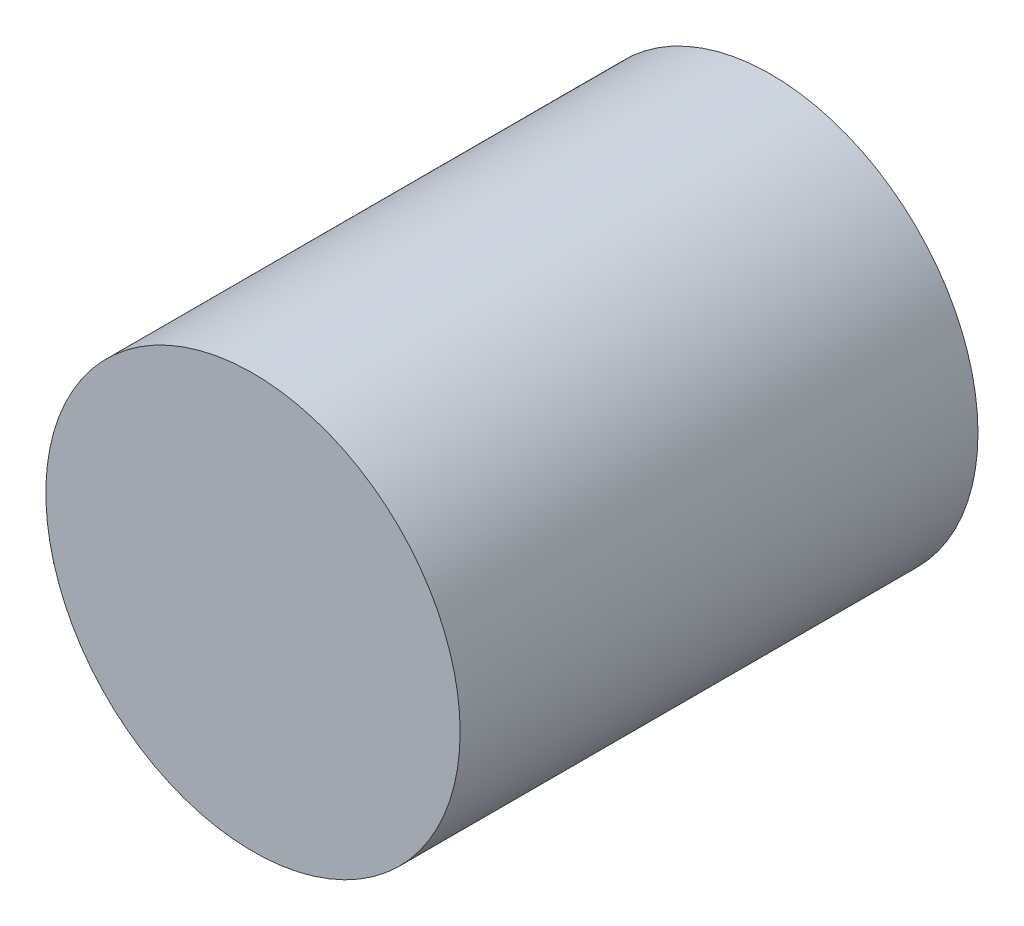
ISO-10303-21;
HEADER;
FILE_DESCRIPTION(('STEP AP214'),'2;1');
FILE_NAME('part.step','',(''),(''),'','','');
FILE_SCHEMA(('AUTOMOTIVE_DESIGN { 1 0 10303 214 1 1 1 1 }'));
ENDSEC;
DATA;
#1=APPLICATION_CONTEXT('core data for automotive mechanical design processes');
#2=APPLICATION_PROTOCOL_DEFINITION('international standard','automotive_design',2000,#1);
#3=PRODUCT_CONTEXT('',#1,'mechanical');
#4=PRODUCT('Part','Part','',(#3));
#5=PRODUCT_RELATED_PRODUCT_CATEGORY('part','',(#4));
#6=PRODUCT_DEFINITION_FORMATION('','',#4);
#7=PRODUCT_DEFINITION_CONTEXT('part definition',#1,'design');
#8=PRODUCT_DEFINITION('design','',#6,#7);
#9=PRODUCT_DEFINITION_SHAPE('','',#8);
#10=(LENGTH_UNIT() NAMED_UNIT(*) SI_UNIT(.MILLI.,.METRE.));
#11=(NAMED_UNIT(*) PLANE_ANGLE_UNIT() SI_UNIT($,.RADIAN.));
#12=(NAMED_UNIT(*) SI_UNIT($,.STERADIAN.) SOLID_ANGLE_UNIT());
#13=UNCERTAINTY_MEASURE_WITH_UNIT(LENGTH_MEASURE(1.E-05),#10,'distance_accuracy_value','');
#14=(GEOMETRIC_REPRESENTATION_CONTEXT(3) GLOBAL_UNCERTAINTY_ASSIGNED_CONTEXT((#13)) GLOBAL_UNIT_ASSIGNED_CONTEXT((#10,
#11,#12)) REPRESENTATION_CONTEXT('',''));
#15=CARTESIAN_POINT('',(0.,0.,0.));
#16=DIRECTION('',(0.,0.,1.));
#17=DIRECTION('',(1.,0.,0.));
#18=AXIS2_PLACEMENT_3D('',#15,#16,#17);
#19=CARTESIAN_POINT('',(0.,0.,200.));
#20=DIRECTION('',(0.,0.,-1.));
#21=DIRECTION('',(-1.,0.,0.));
#22=AXIS2_PLACEMENT_3D('',#19,#20,#21);
#23=CYLINDRICAL_SURFACE('',#22,80.);
#24=CARTESIAN_POINT('',(0.,0.,200.));
#25=DIRECTION('',(0.,0.,1.));
#26=DIRECTION('',(1.,0.,0.));
#27=AXIS2_PLACEMENT_3D('',#24,#25,#26);
#28=CIRCLE('',#27,80.);
#29=CARTESIAN_POINT('',(80.,0.,200.));
#30=VERTEX_POINT('',#29);
#31=EDGE_CURVE('E51',#30,#30,#28,.T.);
#32=ORIENTED_EDGE('',*,*,#31,.F.);
#33=EDGE_LOOP('',(#32));
#34=FACE_BOUND('',#33,.T.);
#35=CARTESIAN_POINT('',(0.,0.,0.));
#36=DIRECTION('',(0.,0.,1.));
#37=DIRECTION('',(1.,0.,0.));
#38=AXIS2_PLACEMENT_3D('',#35,#36,#37);
#39=CIRCLE('',#38,80.);
#40=CARTESIAN_POINT('',(80.,0.,0.));
#41=VERTEX_POINT('',#40);
#42=EDGE_CURVE('E40',#41,#41,#39,.T.);
#43=ORIENTED_EDGE('',*,*,#42,.T.);
#44=EDGE_LOOP('',(#43));
#45=FACE_BOUND('',#44,.T.);
#46=ADVANCED_FACE('F37',(#34,#45),#23,.T.);
#47=CARTESIAN_POINT('',(0.,0.,200.));
#48=DIRECTION('',(0.,0.,1.));
#49=DIRECTION('',(1.,0.,0.));
#50=AXIS2_PLACEMENT_3D('',#47,#48,#49);
#51=PLANE('',#50);
#52=ORIENTED_EDGE('',*,*,#31,.T.);
#53=EDGE_LOOP('',(#52));
#54=FACE_BOUND('',#53,.T.);
#55=ADVANCED_FACE('F72',(#54),#51,.T.);
#56=CARTESIAN_POINT('',(0.,0.,0.));
#57=DIRECTION('',(0.,0.,1.));
#58=DIRECTION('',(1.,0.,0.));
#59=AXIS2_PLACEMENT_3D('',#56,#57,#58);
#60=PLANE('',#59);
#61=CARTESIAN_POINT('',(0.,0.,0.));
#62=DIRECTION('',(0.,0.,-1.));
#63=DIRECTION('',(-1.,0.,0.));
#64=AXIS2_PLACEMENT_3D('',#61,#62,#63);
#65=CIRCLE('',#64,44.);
#66=CARTESIAN_POINT('',(-44.,0.,0.));
#67=VERTEX_POINT('',#66);
#68=EDGE_CURVE('E45',#67,#67,#65,.T.);
#69=ORIENTED_EDGE('',*,*,#68,.F.);
#70=EDGE_LOOP('',(#69));
#71=FACE_BOUND('',#70,.T.);
#72=ORIENTED_EDGE('',*,*,#42,.F.);
#73=EDGE_LOOP('',(#72));
#74=FACE_BOUND('',#73,.T.);
#75=ADVANCED_FACE('F69',(#71,#74),#60,.F.);
#76=CARTESIAN_POINT('',(0.,0.,-14.));
#77=DIRECTION('',(0.,0.,1.));
#78=DIRECTION('',(1.,0.,0.));
#79=AXIS2_PLACEMENT_3D('',#76,#77,#78);
#80=CYLINDRICAL_SURFACE('',#79,44.);
#81=CARTESIAN_POINT('',(0.,0.,-14.));
#82=DIRECTION('',(0.,0.,-1.));
#83=DIRECTION('',(-1.,0.,0.));
#84=AXIS2_PLACEMENT_3D('',#81,#82,#83);
#85=CIRCLE('',#84,44.);
#86=CARTESIAN_POINT('',(-44.,0.,-14.));
#87=VERTEX_POINT('',#86);
#88=EDGE_CURVE('E57',#87,#87,#85,.T.);
#89=ORIENTED_EDGE('',*,*,#88,.F.);
#90=EDGE_LOOP('',(#89));
#91=FACE_BOUND('',#90,.T.);
#92=ORIENTED_EDGE('',*,*,#68,.T.);
#93=EDGE_LOOP('',(#92));
#94=FACE_BOUND('',#93,.T.);
#95=ADVANCED_FACE('F71',(#91,#94),#80,.T.);
#96=CARTESIAN_POINT('',(0.,0.,-14.));
#97=DIRECTION('',(0.,0.,-1.));
#98=DIRECTION('',(-1.,0.,0.));
#99=AXIS2_PLACEMENT_3D('',#96,#97,#98);
#100=PLANE('',#99);
#101=CARTESIAN_POINT('',(0.,0.,-14.));
#102=DIRECTION('',(0.,0.,-1.));
#103=DIRECTION('',(-1.,0.,0.));
#104=AXIS2_PLACEMENT_3D('',#101,#102,#103);
#105=CIRCLE('',#104,30.);
#106=CARTESIAN_POINT('',(-30.,0.,-14.));
#107=VERTEX_POINT('',#106);
#108=EDGE_CURVE('E10',#107,#107,#105,.T.);
#109=ORIENTED_EDGE('',*,*,#108,.F.);
#110=EDGE_LOOP('',(#109));
#111=FACE_BOUND('',#110,.T.);
#112=ORIENTED_EDGE('',*,*,#88,.T.);
#113=EDGE_LOOP('',(#112));
#114=FACE_BOUND('',#113,.T.);
#115=ADVANCED_FACE('F78',(#111,#114),#100,.T.);
#116=CARTESIAN_POINT('',(0.,0.,-21.));
#117=DIRECTION('',(0.,0.,1.));
#118=DIRECTION('',(1.,0.,0.));
#119=AXIS2_PLACEMENT_3D('',#116,#117,#118);
#120=CYLINDRICAL_SURFACE('',#119,30.);
#121=CARTESIAN_POINT('',(0.,0.,-21.));
#122=DIRECTION('',(0.,0.,-1.));
#123=DIRECTION('',(-1.,0.,0.));
#124=AXIS2_PLACEMENT_3D('',#121,#122,#123);
#125=CIRCLE('',#124,30.);
#126=CARTESIAN_POINT('',(-30.,0.,-21.));
#127=VERTEX_POINT('',#126);
#128=EDGE_CURVE('E55',#127,#127,#125,.T.);
#129=ORIENTED_EDGE('',*,*,#128,.F.);
#130=EDGE_LOOP('',(#129));
#131=FACE_BOUND('',#130,.T.);
#132=ORIENTED_EDGE('',*,*,#108,.T.);
#133=EDGE_LOOP('',(#132));
#134=FACE_BOUND('',#133,.T.);
#135=ADVANCED_FACE('F110',(#131,#134),#120,.T.);
#136=CARTESIAN_POINT('',(0.,0.,-21.));
#137=DIRECTION('',(0.,0.,-1.));
#138=DIRECTION('',(-1.,0.,0.));
#139=AXIS2_PLACEMENT_3D('',#136,#137,#138);
#140=PLANE('',#139);
#141=CARTESIAN_POINT('',(0.,0.,-21.));
#142=DIRECTION('',(0.,0.,-1.));
#143=DIRECTION('',(-1.,0.,0.));
#144=AXIS2_PLACEMENT_3D('',#141,#142,#143);
#145=CIRCLE('',#144,21.5);
#146=CARTESIAN_POINT('',(-21.5,0.,-21.));
#147=VERTEX_POINT('',#146);
#148=EDGE_CURVE('E158',#147,#147,#145,.T.);
#149=ORIENTED_EDGE('',*,*,#148,.F.);
#150=EDGE_LOOP('',(#149));
#151=FACE_BOUND('',#150,.T.);
#152=ORIENTED_EDGE('',*,*,#128,.T.);
#153=EDGE_LOOP('',(#152));
#154=FACE_BOUND('',#153,.T.);
#155=ADVANCED_FACE('F120',(#151,#154),#140,.T.);
#156=CARTESIAN_POINT('',(0.,0.,-14.));
#157=DIRECTION('',(0.,0.,-1.));
#158=DIRECTION('',(-1.,0.,0.));
#159=AXIS2_PLACEMENT_3D('',#156,#157,#158);
#160=CYLINDRICAL_SURFACE('',#159,21.5);
#161=CARTESIAN_POINT('',(0.,0.,-14.));
#162=DIRECTION('',(0.,0.,-1.));
#163=DIRECTION('',(-1.,0.,0.));
#164=AXIS2_PLACEMENT_3D('',#161,#162,#163);
#165=CIRCLE('',#164,21.5);
#166=CARTESIAN_POINT('',(-21.5,0.,-14.));
#167=VERTEX_POINT('',#166);
#168=EDGE_CURVE('E156',#167,#167,#165,.T.);
#169=ORIENTED_EDGE('',*,*,#168,.F.);
#170=EDGE_LOOP('',(#169));
#171=FACE_BOUND('',#170,.T.);
#172=ORIENTED_EDGE('',*,*,#148,.T.);
#173=EDGE_LOOP('',(#172));
#174=FACE_BOUND('',#173,.T.);
#175=ADVANCED_FACE('F130',(#171,#174),#160,.F.);
#176=CARTESIAN_POINT('',(0.,0.,-14.));
#177=DIRECTION('',(0.,0.,-1.));
#178=DIRECTION('',(-1.,0.,0.));
#179=AXIS2_PLACEMENT_3D('',#176,#177,#178);
#180=PLANE('',#179);
#181=ORIENTED_EDGE('',*,*,#168,.T.);
#182=EDGE_LOOP('',(#181));
#183=FACE_BOUND('',#182,.T.);
#184=ADVANCED_FACE('F140',(#183),#180,.T.);
#185=CLOSED_SHELL('',(#46,#55,#75,#95,#115,#135,#155,#175,#184));
#186=MANIFOLD_SOLID_BREP('B2',#185);
#187=ADVANCED_BREP_SHAPE_REPRESENTATION('',(#18,#186),#14);
#188=SHAPE_DEFINITION_REPRESENTATION(#9,#187);
ENDSEC;
END-ISO-10303-21;
